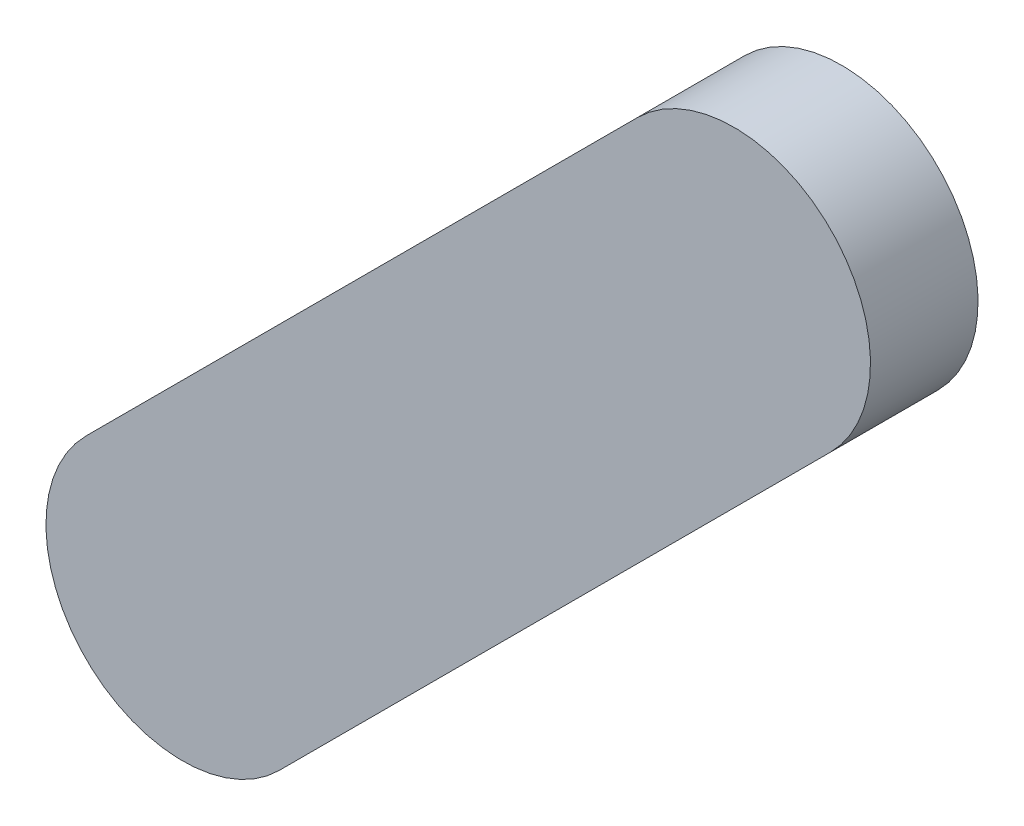
ISO-10303-21;
HEADER;
FILE_DESCRIPTION(('STEP AP214'),'2;1');
FILE_NAME('part.step','',(''),(''),'','','');
FILE_SCHEMA(('AUTOMOTIVE_DESIGN { 1 0 10303 214 1 1 1 1 }'));
ENDSEC;
DATA;
#1=APPLICATION_CONTEXT('core data for automotive mechanical design processes');
#2=APPLICATION_PROTOCOL_DEFINITION('international standard','automotive_design',2000,#1);
#3=PRODUCT_CONTEXT('',#1,'mechanical');
#4=PRODUCT('Part','Part','',(#3));
#5=PRODUCT_RELATED_PRODUCT_CATEGORY('part','',(#4));
#6=PRODUCT_DEFINITION_FORMATION('','',#4);
#7=PRODUCT_DEFINITION_CONTEXT('part definition',#1,'design');
#8=PRODUCT_DEFINITION('design','',#6,#7);
#9=PRODUCT_DEFINITION_SHAPE('','',#8);
#10=(LENGTH_UNIT() NAMED_UNIT(*) SI_UNIT(.MILLI.,.METRE.));
#11=(NAMED_UNIT(*) PLANE_ANGLE_UNIT() SI_UNIT($,.RADIAN.));
#12=(NAMED_UNIT(*) SI_UNIT($,.STERADIAN.) SOLID_ANGLE_UNIT());
#13=UNCERTAINTY_MEASURE_WITH_UNIT(LENGTH_MEASURE(1.E-05),#10,'distance_accuracy_value','');
#14=(GEOMETRIC_REPRESENTATION_CONTEXT(3) GLOBAL_UNCERTAINTY_ASSIGNED_CONTEXT((#13)) GLOBAL_UNIT_ASSIGNED_CONTEXT((#10,
#11,#12)) REPRESENTATION_CONTEXT('',''));
#15=CARTESIAN_POINT('',(0.,0.,0.));
#16=DIRECTION('',(0.,0.,1.));
#17=DIRECTION('',(1.,0.,0.));
#18=AXIS2_PLACEMENT_3D('',#15,#16,#17);
#19=CARTESIAN_POINT('',(131.37060594,96.14441274,0.));
#20=DIRECTION('',(-0.707106781186543,0.707106781186553,0.));
#21=DIRECTION('',(0.707106781186553,0.707106781186543,0.));
#22=AXIS2_PLACEMENT_3D('',#19,#20,#21);
#23=PLANE('',#22);
#24=DIRECTION('',(0.707106781186553,0.707106781186543,0.));
#25=VECTOR('',#24,1.);
#26=CARTESIAN_POINT('',(131.37060594,96.14441274,0.1999996));
#27=LINE('',#26,#25);
#28=CARTESIAN_POINT('',(131.37060594,96.14441274,0.1999996));
#29=VERTEX_POINT('',#28);
#30=CARTESIAN_POINT('',(132.3960903,97.1698971,0.1999996));
#31=VERTEX_POINT('',#30);
#32=EDGE_CURVE('E11',#29,#31,#27,.T.);
#33=ORIENTED_EDGE('',*,*,#32,.F.);
#34=DIRECTION('',(0.,0.,1.));
#35=VECTOR('',#34,1.);
#36=CARTESIAN_POINT('',(131.37060594,96.14441274,0.));
#37=LINE('',#36,#35);
#38=CARTESIAN_POINT('',(131.37060594,96.14441274,0.));
#39=VERTEX_POINT('',#38);
#40=EDGE_CURVE('E24',#39,#29,#37,.T.);
#41=ORIENTED_EDGE('',*,*,#40,.F.);
#42=DIRECTION('',(0.707106781186553,0.707106781186543,0.));
#43=VECTOR('',#42,1.);
#44=CARTESIAN_POINT('',(131.37060594,96.14441274,0.));
#45=LINE('',#44,#43);
#46=CARTESIAN_POINT('',(132.3960903,97.1698971,0.));
#47=VERTEX_POINT('',#46);
#48=EDGE_CURVE('E75',#39,#47,#45,.T.);
#49=ORIENTED_EDGE('',*,*,#48,.T.);
#50=DIRECTION('',(0.,0.,1.));
#51=VECTOR('',#50,1.);
#52=CARTESIAN_POINT('',(132.3960903,97.1698971,0.));
#53=LINE('',#52,#51);
#54=EDGE_CURVE('E37',#47,#31,#53,.T.);
#55=ORIENTED_EDGE('',*,*,#54,.T.);
#56=EDGE_LOOP('',(#33,#41,#49,#55));
#57=FACE_BOUND('',#56,.T.);
#58=ADVANCED_FACE('F17',(#57),#23,.F.);
#59=CARTESIAN_POINT('',(132.21648436,97.34950304,0.));
#60=DIRECTION('',(0.,0.,-1.));
#61=DIRECTION('',(0.707106781186576,-0.70710678118652,0.));
#62=AXIS2_PLACEMENT_3D('',#59,#60,#61);
#63=CYLINDRICAL_SURFACE('',#62,0.254001156230774);
#64=CARTESIAN_POINT('',(132.21648436,97.34950304,0.1999996));
#65=DIRECTION('',(0.,0.,1.));
#66=DIRECTION('',(0.707106781186576,-0.70710678118652,0.));
#67=AXIS2_PLACEMENT_3D('',#64,#65,#66);
#68=CIRCLE('',#67,0.254001156230774);
#69=CARTESIAN_POINT('',(132.03687842,97.52910898,0.1999996));
#70=VERTEX_POINT('',#69);
#71=EDGE_CURVE('E83',#31,#70,#68,.T.);
#72=ORIENTED_EDGE('',*,*,#71,.F.);
#73=ORIENTED_EDGE('',*,*,#54,.F.);
#74=CARTESIAN_POINT('',(132.21648436,97.34950304,0.));
#75=DIRECTION('',(0.,0.,1.));
#76=DIRECTION('',(0.707106781186576,-0.70710678118652,0.));
#77=AXIS2_PLACEMENT_3D('',#74,#75,#76);
#78=CIRCLE('',#77,0.254001156230774);
#79=CARTESIAN_POINT('',(132.03687842,97.52910898,0.));
#80=VERTEX_POINT('',#79);
#81=EDGE_CURVE('E81',#47,#80,#78,.T.);
#82=ORIENTED_EDGE('',*,*,#81,.T.);
#83=DIRECTION('',(0.,0.,1.));
#84=VECTOR('',#83,1.);
#85=CARTESIAN_POINT('',(132.03687842,97.52910898,0.));
#86=LINE('',#85,#84);
#87=EDGE_CURVE('E67',#80,#70,#86,.T.);
#88=ORIENTED_EDGE('',*,*,#87,.T.);
#89=EDGE_LOOP('',(#72,#73,#82,#88));
#90=FACE_BOUND('',#89,.T.);
#91=ADVANCED_FACE('F89',(#90),#63,.T.);
#92=CARTESIAN_POINT('',(132.03687842,97.52910898,0.));
#93=DIRECTION('',(0.707106781186543,-0.707106781186553,0.));
#94=DIRECTION('',(-0.707106781186553,-0.707106781186543,0.));
#95=AXIS2_PLACEMENT_3D('',#92,#93,#94);
#96=PLANE('',#95);
#97=DIRECTION('',(-0.707106781186553,-0.707106781186543,0.));
#98=VECTOR('',#97,1.);
#99=CARTESIAN_POINT('',(132.03687842,97.52910898,0.1999996));
#100=LINE('',#99,#98);
#101=CARTESIAN_POINT('',(131.01139406,96.50362462,0.1999996));
#102=VERTEX_POINT('',#101);
#103=EDGE_CURVE('E71',#70,#102,#100,.T.);
#104=ORIENTED_EDGE('',*,*,#103,.F.);
#105=ORIENTED_EDGE('',*,*,#87,.F.);
#106=DIRECTION('',(-0.707106781186553,-0.707106781186543,0.));
#107=VECTOR('',#106,1.);
#108=CARTESIAN_POINT('',(132.03687842,97.52910898,0.));
#109=LINE('',#108,#107);
#110=CARTESIAN_POINT('',(131.01139406,96.50362462,0.));
#111=VERTEX_POINT('',#110);
#112=EDGE_CURVE('E63',#80,#111,#109,.T.);
#113=ORIENTED_EDGE('',*,*,#112,.T.);
#114=DIRECTION('',(0.,0.,1.));
#115=VECTOR('',#114,1.);
#116=CARTESIAN_POINT('',(131.01139406,96.50362462,0.));
#117=LINE('',#116,#115);
#118=EDGE_CURVE('E53',#111,#102,#117,.T.);
#119=ORIENTED_EDGE('',*,*,#118,.T.);
#120=EDGE_LOOP('',(#104,#105,#113,#119));
#121=FACE_BOUND('',#120,.T.);
#122=ADVANCED_FACE('F66',(#121),#96,.F.);
#123=CARTESIAN_POINT('',(131.191,96.32401868,0.));
#124=DIRECTION('',(0.,0.,-1.));
#125=DIRECTION('',(-0.70710678118652,0.707106781186576,0.));
#126=AXIS2_PLACEMENT_3D('',#123,#124,#125);
#127=CYLINDRICAL_SURFACE('',#126,0.254001156230768);
#128=CARTESIAN_POINT('',(131.191,96.32401868,0.1999996));
#129=DIRECTION('',(0.,0.,1.));
#130=DIRECTION('',(-0.70710678118652,0.707106781186576,0.));
#131=AXIS2_PLACEMENT_3D('',#128,#129,#130);
#132=CIRCLE('',#131,0.254001156230768);
#133=EDGE_CURVE('E59',#102,#29,#132,.T.);
#134=ORIENTED_EDGE('',*,*,#133,.F.);
#135=ORIENTED_EDGE('',*,*,#118,.F.);
#136=CARTESIAN_POINT('',(131.191,96.32401868,0.));
#137=DIRECTION('',(0.,0.,1.));
#138=DIRECTION('',(-0.70710678118652,0.707106781186576,0.));
#139=AXIS2_PLACEMENT_3D('',#136,#137,#138);
#140=CIRCLE('',#139,0.254001156230768);
#141=EDGE_CURVE('E57',#111,#39,#140,.T.);
#142=ORIENTED_EDGE('',*,*,#141,.T.);
#143=ORIENTED_EDGE('',*,*,#40,.T.);
#144=EDGE_LOOP('',(#134,#135,#142,#143));
#145=FACE_BOUND('',#144,.T.);
#146=ADVANCED_FACE('F55',(#145),#127,.T.);
#147=CARTESIAN_POINT('',(131.37060594,96.14441274,0.));
#148=DIRECTION('',(0.,0.,-1.));
#149=DIRECTION('',(-1.,0.,0.));
#150=AXIS2_PLACEMENT_3D('',#147,#148,#149);
#151=PLANE('',#150);
#152=ORIENTED_EDGE('',*,*,#141,.F.);
#153=ORIENTED_EDGE('',*,*,#112,.F.);
#154=ORIENTED_EDGE('',*,*,#81,.F.);
#155=ORIENTED_EDGE('',*,*,#48,.F.);
#156=EDGE_LOOP('',(#152,#153,#154,#155));
#157=FACE_BOUND('',#156,.T.);
#158=ADVANCED_FACE('F74',(#157),#151,.T.);
#159=CARTESIAN_POINT('',(131.37060594,96.14441274,0.1999996));
#160=DIRECTION('',(0.,0.,-1.));
#161=DIRECTION('',(-1.,0.,0.));
#162=AXIS2_PLACEMENT_3D('',#159,#160,#161);
#163=PLANE('',#162);
#164=ORIENTED_EDGE('',*,*,#32,.T.);
#165=ORIENTED_EDGE('',*,*,#71,.T.);
#166=ORIENTED_EDGE('',*,*,#103,.T.);
#167=ORIENTED_EDGE('',*,*,#133,.T.);
#168=EDGE_LOOP('',(#164,#165,#166,#167));
#169=FACE_BOUND('',#168,.T.);
#170=ADVANCED_FACE('F91',(#169),#163,.F.);
#171=CLOSED_SHELL('',(#58,#91,#122,#146,#158,#170));
#172=MANIFOLD_SOLID_BREP('B1',#171);
#173=ADVANCED_BREP_SHAPE_REPRESENTATION('',(#18,#172),#14);
#174=SHAPE_DEFINITION_REPRESENTATION(#9,#173);
ENDSEC;
END-ISO-10303-21;
